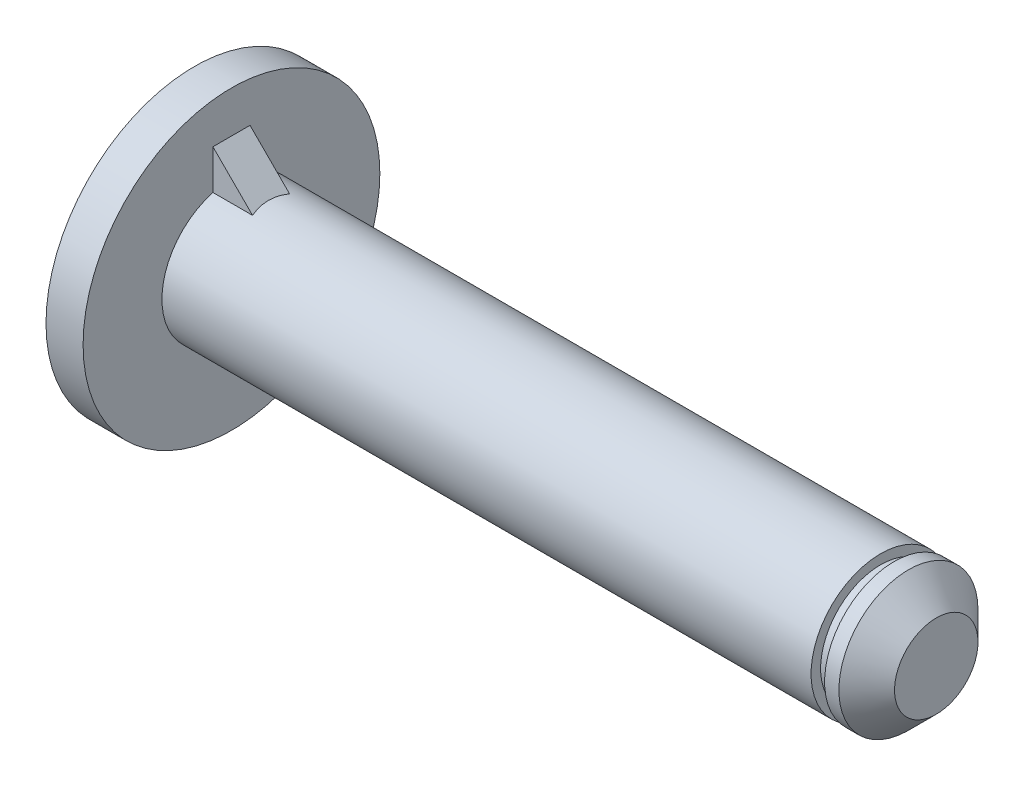
ISO-10303-21;
HEADER;
FILE_DESCRIPTION(('STEP AP214'),'2;1');
FILE_NAME('part.step','',(''),(''),'','','');
FILE_SCHEMA(('AUTOMOTIVE_DESIGN { 1 0 10303 214 1 1 1 1 }'));
ENDSEC;
DATA;
#1=APPLICATION_CONTEXT('core data for automotive mechanical design processes');
#2=APPLICATION_PROTOCOL_DEFINITION('international standard','automotive_design',2000,#1);
#3=PRODUCT_CONTEXT('',#1,'mechanical');
#4=PRODUCT('Part','Part','',(#3));
#5=PRODUCT_RELATED_PRODUCT_CATEGORY('part','',(#4));
#6=PRODUCT_DEFINITION_FORMATION('','',#4);
#7=PRODUCT_DEFINITION_CONTEXT('part definition',#1,'design');
#8=PRODUCT_DEFINITION('design','',#6,#7);
#9=PRODUCT_DEFINITION_SHAPE('','',#8);
#10=(LENGTH_UNIT() NAMED_UNIT(*) SI_UNIT(.MILLI.,.METRE.));
#11=(NAMED_UNIT(*) PLANE_ANGLE_UNIT() SI_UNIT($,.RADIAN.));
#12=(NAMED_UNIT(*) SI_UNIT($,.STERADIAN.) SOLID_ANGLE_UNIT());
#13=UNCERTAINTY_MEASURE_WITH_UNIT(LENGTH_MEASURE(1.E-05),#10,'distance_accuracy_value','');
#14=(GEOMETRIC_REPRESENTATION_CONTEXT(3) GLOBAL_UNCERTAINTY_ASSIGNED_CONTEXT((#13)) GLOBAL_UNIT_ASSIGNED_CONTEXT((#10,
#11,#12)) REPRESENTATION_CONTEXT('',''));
#15=CARTESIAN_POINT('',(0.,0.,0.));
#16=DIRECTION('',(0.,0.,1.));
#17=DIRECTION('',(1.,0.,0.));
#18=AXIS2_PLACEMENT_3D('',#15,#16,#17);
#19=CARTESIAN_POINT('',(-10.1111111111111,8.,0.));
#20=DIRECTION('',(-1.,0.,0.));
#21=DIRECTION('',(0.,0.,1.));
#22=AXIS2_PLACEMENT_3D('',#19,#20,#21);
#23=CYLINDRICAL_SURFACE('',#22,3.75);
#24=CARTESIAN_POINT('',(37.,8.,0.));
#25=DIRECTION('',(1.,0.,0.));
#26=DIRECTION('',(0.,0.,-1.));
#27=AXIS2_PLACEMENT_3D('',#24,#25,#26);
#28=CIRCLE('',#27,3.75);
#29=CARTESIAN_POINT('',(37.,8.,-3.75));
#30=VERTEX_POINT('',#29);
#31=EDGE_CURVE('E91',#30,#30,#28,.T.);
#32=ORIENTED_EDGE('',*,*,#31,.F.);
#33=EDGE_LOOP('',(#32));
#34=FACE_BOUND('',#33,.T.);
#35=DIRECTION('',(-1.,0.,0.));
#36=VECTOR('',#35,1.);
#37=CARTESIAN_POINT('',(-10.1111111111111,11.6142080737002,1.));
#38=LINE('',#37,#36);
#39=CARTESIAN_POINT('',(2.,11.6142080737002,1.));
#40=VERTEX_POINT('',#39);
#41=CARTESIAN_POINT('',(4.13579192629976,11.6142080737002,1.));
#42=VERTEX_POINT('',#41);
#43=EDGE_CURVE('E112',#40,#42,#38,.F.);
#44=ORIENTED_EDGE('',*,*,#43,.F.);
#45=CARTESIAN_POINT('',(2.,8.,0.));
#46=DIRECTION('',(-1.,0.,0.));
#47=DIRECTION('',(0.,0.,1.));
#48=AXIS2_PLACEMENT_3D('',#45,#46,#47);
#49=CIRCLE('',#48,3.75);
#50=CARTESIAN_POINT('',(2.,11.6142080737002,-1.));
#51=VERTEX_POINT('',#50);
#52=EDGE_CURVE('E95',#51,#40,#49,.T.);
#53=ORIENTED_EDGE('',*,*,#52,.F.);
#54=DIRECTION('',(-1.,0.,0.));
#55=VECTOR('',#54,1.);
#56=CARTESIAN_POINT('',(-10.1111111111111,11.6142080737002,-1.));
#57=LINE('',#56,#55);
#58=CARTESIAN_POINT('',(4.13579192629976,11.6142080737002,-1.));
#59=VERTEX_POINT('',#58);
#60=EDGE_CURVE('E77',#51,#59,#57,.F.);
#61=ORIENTED_EDGE('',*,*,#60,.T.);
#62=CARTESIAN_POINT('',(7.74999999999999,8.,0.));
#63=DIRECTION('',(-0.707106781186548,-0.707106781186547,0.));
#64=DIRECTION('',(-0.707106781186547,0.707106781186548,0.));
#65=AXIS2_PLACEMENT_3D('',#62,#63,#64);
#66=ELLIPSE('',#65,5.3033008588991,3.75);
#67=EDGE_CURVE('E89',#42,#59,#66,.T.);
#68=ORIENTED_EDGE('',*,*,#67,.F.);
#69=EDGE_LOOP('',(#44,#53,#61,#68));
#70=FACE_BOUND('',#69,.T.);
#71=ADVANCED_FACE('F39',(#34,#70),#23,.T.);
#72=CARTESIAN_POINT('',(0.,7.99999999999999,0.));
#73=DIRECTION('',(-1.,0.,0.));
#74=DIRECTION('',(0.,0.,1.));
#75=AXIS2_PLACEMENT_3D('',#72,#73,#74);
#76=PLANE('',#75);
#77=CARTESIAN_POINT('',(0.,8.,0.));
#78=DIRECTION('',(-1.,0.,0.));
#79=DIRECTION('',(0.,0.,1.));
#80=AXIS2_PLACEMENT_3D('',#77,#78,#79);
#81=CIRCLE('',#80,8.);
#82=CARTESIAN_POINT('',(0.,8.,8.));
#83=VERTEX_POINT('',#82);
#84=EDGE_CURVE('E106',#83,#83,#81,.T.);
#85=ORIENTED_EDGE('',*,*,#84,.T.);
#86=EDGE_LOOP('',(#85));
#87=FACE_BOUND('',#86,.T.);
#88=ADVANCED_FACE('F136',(#87),#76,.T.);
#89=CARTESIAN_POINT('',(-10.1111111111111,8.,0.));
#90=DIRECTION('',(-1.,0.,0.));
#91=DIRECTION('',(0.,0.,1.));
#92=AXIS2_PLACEMENT_3D('',#89,#90,#91);
#93=CYLINDRICAL_SURFACE('',#92,8.);
#94=ORIENTED_EDGE('',*,*,#84,.F.);
#95=EDGE_LOOP('',(#94));
#96=FACE_BOUND('',#95,.T.);
#97=CARTESIAN_POINT('',(2.,8.,0.));
#98=DIRECTION('',(-1.,0.,0.));
#99=DIRECTION('',(0.,0.,1.));
#100=AXIS2_PLACEMENT_3D('',#97,#98,#99);
#101=CIRCLE('',#100,8.);
#102=CARTESIAN_POINT('',(2.,8.,8.));
#103=VERTEX_POINT('',#102);
#104=EDGE_CURVE('E99',#103,#103,#101,.T.);
#105=ORIENTED_EDGE('',*,*,#104,.T.);
#106=EDGE_LOOP('',(#105));
#107=FACE_BOUND('',#106,.T.);
#108=ADVANCED_FACE('F141',(#96,#107),#93,.T.);
#109=CARTESIAN_POINT('',(2.,0.,0.));
#110=DIRECTION('',(1.,0.,0.));
#111=DIRECTION('',(0.,0.,-1.));
#112=AXIS2_PLACEMENT_3D('',#109,#110,#111);
#113=PLANE('',#112);
#114=ORIENTED_EDGE('',*,*,#104,.F.);
#115=EDGE_LOOP('',(#114));
#116=FACE_BOUND('',#115,.T.);
#117=ORIENTED_EDGE('',*,*,#52,.T.);
#118=DIRECTION('',(0.,-1.,0.));
#119=VECTOR('',#118,1.);
#120=CARTESIAN_POINT('',(2.,0.,1.));
#121=LINE('',#120,#119);
#122=CARTESIAN_POINT('',(2.,13.75,1.));
#123=VERTEX_POINT('',#122);
#124=EDGE_CURVE('E63',#123,#40,#121,.T.);
#125=ORIENTED_EDGE('',*,*,#124,.F.);
#126=DIRECTION('',(0.,0.,-1.));
#127=VECTOR('',#126,1.);
#128=CARTESIAN_POINT('',(2.,13.75,0.));
#129=LINE('',#128,#127);
#130=CARTESIAN_POINT('',(2.,13.75,-1.));
#131=VERTEX_POINT('',#130);
#132=EDGE_CURVE('E87',#131,#123,#129,.F.);
#133=ORIENTED_EDGE('',*,*,#132,.F.);
#134=DIRECTION('',(0.,-1.,0.));
#135=VECTOR('',#134,1.);
#136=CARTESIAN_POINT('',(2.,0.,-1.));
#137=LINE('',#136,#135);
#138=EDGE_CURVE('E74',#131,#51,#137,.T.);
#139=ORIENTED_EDGE('',*,*,#138,.T.);
#140=EDGE_LOOP('',(#117,#125,#133,#139));
#141=FACE_BOUND('',#140,.T.);
#142=ADVANCED_FACE('F93',(#116,#141),#113,.T.);
#143=CARTESIAN_POINT('',(20.,8.,1.));
#144=DIRECTION('',(0.,0.,1.));
#145=DIRECTION('',(1.,0.,0.));
#146=AXIS2_PLACEMENT_3D('',#143,#144,#145);
#147=PLANE('',#146);
#148=ORIENTED_EDGE('',*,*,#124,.T.);
#149=ORIENTED_EDGE('',*,*,#43,.T.);
#150=DIRECTION('',(0.707106781186547,-0.707106781186548,0.));
#151=VECTOR('',#150,1.);
#152=CARTESIAN_POINT('',(2.,13.75,1.));
#153=LINE('',#152,#151);
#154=EDGE_CURVE('E82',#123,#42,#153,.T.);
#155=ORIENTED_EDGE('',*,*,#154,.F.);
#156=EDGE_LOOP('',(#148,#149,#155));
#157=FACE_BOUND('',#156,.T.);
#158=ADVANCED_FACE('F149',(#157),#147,.T.);
#159=CARTESIAN_POINT('',(20.,8.,-1.));
#160=DIRECTION('',(0.,0.,1.));
#161=DIRECTION('',(1.,0.,0.));
#162=AXIS2_PLACEMENT_3D('',#159,#160,#161);
#163=PLANE('',#162);
#164=ORIENTED_EDGE('',*,*,#138,.F.);
#165=DIRECTION('',(0.707106781186547,-0.707106781186548,0.));
#166=VECTOR('',#165,1.);
#167=CARTESIAN_POINT('',(2.,13.75,-1.));
#168=LINE('',#167,#166);
#169=EDGE_CURVE('E55',#131,#59,#168,.T.);
#170=ORIENTED_EDGE('',*,*,#169,.T.);
#171=ORIENTED_EDGE('',*,*,#60,.F.);
#172=EDGE_LOOP('',(#164,#170,#171));
#173=FACE_BOUND('',#172,.T.);
#174=ADVANCED_FACE('F75',(#173),#163,.F.);
#175=CARTESIAN_POINT('',(2.,13.75,0.));
#176=DIRECTION('',(-0.707106781186548,-0.707106781186547,0.));
#177=DIRECTION('',(0.707106781186547,-0.707106781186548,0.));
#178=AXIS2_PLACEMENT_3D('',#175,#176,#177);
#179=PLANE('',#178);
#180=ORIENTED_EDGE('',*,*,#169,.F.);
#181=ORIENTED_EDGE('',*,*,#132,.T.);
#182=ORIENTED_EDGE('',*,*,#154,.T.);
#183=ORIENTED_EDGE('',*,*,#67,.T.);
#184=EDGE_LOOP('',(#180,#181,#182,#183));
#185=FACE_BOUND('',#184,.T.);
#186=ADVANCED_FACE('F85',(#185),#179,.F.);
#187=CARTESIAN_POINT('',(37.,11.75,0.));
#188=DIRECTION('',(-1.,0.,0.));
#189=DIRECTION('',(0.,0.,1.));
#190=AXIS2_PLACEMENT_3D('',#187,#188,#189);
#191=PLANE('',#190);
#192=CARTESIAN_POINT('',(37.,8.,0.));
#193=DIRECTION('',(1.,0.,0.));
#194=DIRECTION('',(0.,0.,-1.));
#195=AXIS2_PLACEMENT_3D('',#192,#193,#194);
#196=CIRCLE('',#195,3.235);
#197=CARTESIAN_POINT('',(37.,8.,-3.235));
#198=VERTEX_POINT('',#197);
#199=EDGE_CURVE('E260',#198,#198,#196,.T.);
#200=ORIENTED_EDGE('',*,*,#199,.F.);
#201=EDGE_LOOP('',(#200));
#202=FACE_BOUND('',#201,.T.);
#203=ORIENTED_EDGE('',*,*,#31,.T.);
#204=EDGE_LOOP('',(#203));
#205=FACE_BOUND('',#204,.T.);
#206=ADVANCED_FACE('F182',(#202,#205),#191,.F.);
#207=CARTESIAN_POINT('',(40.,8.,0.));
#208=DIRECTION('',(1.,0.,0.));
#209=DIRECTION('',(0.,0.,-1.));
#210=AXIS2_PLACEMENT_3D('',#207,#208,#209);
#211=CYLINDRICAL_SURFACE('',#210,3.235);
#212=CARTESIAN_POINT('',(37.73,8.,0.));
#213=DIRECTION('',(1.,0.,0.));
#214=DIRECTION('',(0.,0.,-1.));
#215=AXIS2_PLACEMENT_3D('',#212,#213,#214);
#216=CIRCLE('',#215,3.235);
#217=CARTESIAN_POINT('',(37.73,8.,-3.235));
#218=VERTEX_POINT('',#217);
#219=EDGE_CURVE('E258',#218,#218,#216,.T.);
#220=ORIENTED_EDGE('',*,*,#219,.F.);
#221=EDGE_LOOP('',(#220));
#222=FACE_BOUND('',#221,.T.);
#223=ORIENTED_EDGE('',*,*,#199,.T.);
#224=EDGE_LOOP('',(#223));
#225=FACE_BOUND('',#224,.T.);
#226=ADVANCED_FACE('F189',(#222,#225),#211,.T.);
#227=CARTESIAN_POINT('',(37.73,11.235,0.));
#228=DIRECTION('',(1.,0.,0.));
#229=DIRECTION('',(0.,0.,-1.));
#230=AXIS2_PLACEMENT_3D('',#227,#228,#229);
#231=PLANE('',#230);
#232=CARTESIAN_POINT('',(37.73,8.,0.));
#233=DIRECTION('',(1.,0.,0.));
#234=DIRECTION('',(0.,0.,-1.));
#235=AXIS2_PLACEMENT_3D('',#232,#233,#234);
#236=CIRCLE('',#235,3.75);
#237=CARTESIAN_POINT('',(37.73,8.,-3.75));
#238=VERTEX_POINT('',#237);
#239=EDGE_CURVE('E255',#238,#238,#236,.T.);
#240=ORIENTED_EDGE('',*,*,#239,.F.);
#241=EDGE_LOOP('',(#240));
#242=FACE_BOUND('',#241,.T.);
#243=ORIENTED_EDGE('',*,*,#219,.T.);
#244=EDGE_LOOP('',(#243));
#245=FACE_BOUND('',#244,.T.);
#246=ADVANCED_FACE('F131',(#242,#245),#231,.F.);
#247=CARTESIAN_POINT('',(40.,4.25,0.));
#248=DIRECTION('',(1.,0.,0.));
#249=DIRECTION('',(0.,0.,-1.));
#250=AXIS2_PLACEMENT_3D('',#247,#248,#249);
#251=PLANE('',#250);
#252=CARTESIAN_POINT('',(40.,8.,0.));
#253=DIRECTION('',(1.,0.,0.));
#254=DIRECTION('',(0.,0.,-1.));
#255=AXIS2_PLACEMENT_3D('',#252,#253,#254);
#256=CIRCLE('',#255,2.25);
#257=CARTESIAN_POINT('',(40.,8.,-2.25));
#258=VERTEX_POINT('',#257);
#259=EDGE_CURVE('E11',#258,#258,#256,.T.);
#260=ORIENTED_EDGE('',*,*,#259,.T.);
#261=EDGE_LOOP('',(#260));
#262=FACE_BOUND('',#261,.T.);
#263=ADVANCED_FACE('F123',(#262),#251,.T.);
#264=CARTESIAN_POINT('',(38.5,8.,0.));
#265=DIRECTION('',(-1.,0.,0.));
#266=DIRECTION('',(0.,0.,1.));
#267=AXIS2_PLACEMENT_3D('',#264,#265,#266);
#268=CONICAL_SURFACE('',#267,3.75,0.785398163397452);
#269=ORIENTED_EDGE('',*,*,#259,.F.);
#270=EDGE_LOOP('',(#269));
#271=FACE_BOUND('',#270,.T.);
#272=CARTESIAN_POINT('',(38.5,8.,0.));
#273=DIRECTION('',(1.,0.,0.));
#274=DIRECTION('',(0.,0.,-1.));
#275=AXIS2_PLACEMENT_3D('',#272,#273,#274);
#276=CIRCLE('',#275,3.75);
#277=CARTESIAN_POINT('',(38.5,8.,-3.75));
#278=VERTEX_POINT('',#277);
#279=EDGE_CURVE('E48',#278,#278,#276,.F.);
#280=ORIENTED_EDGE('',*,*,#279,.F.);
#281=EDGE_LOOP('',(#280));
#282=FACE_BOUND('',#281,.T.);
#283=ADVANCED_FACE('F41',(#271,#282),#268,.T.);
#284=ORIENTED_EDGE('',*,*,#239,.T.);
#285=EDGE_LOOP('',(#284));
#286=FACE_BOUND('',#285,.T.);
#287=ORIENTED_EDGE('',*,*,#279,.T.);
#288=EDGE_LOOP('',(#287));
#289=FACE_BOUND('',#288,.T.);
#290=ADVANCED_FACE('F120',(#286,#289),#23,.T.);
#291=CLOSED_SHELL('',(#71,#88,#108,#142,#158,#174,#186,#206,#226,#246,#263,#283,#290));
#292=MANIFOLD_SOLID_BREP('B2',#291);
#293=ADVANCED_BREP_SHAPE_REPRESENTATION('',(#18,#292),#14);
#294=SHAPE_DEFINITION_REPRESENTATION(#9,#293);
ENDSEC;
END-ISO-10303-21;
